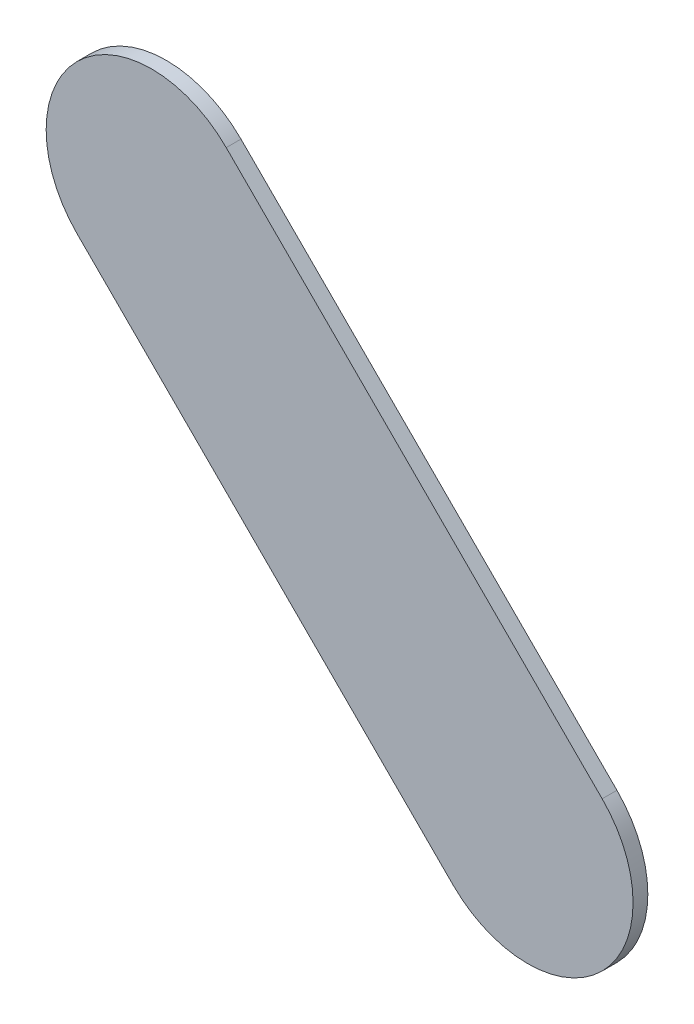
ISO-10303-21;
HEADER;
FILE_DESCRIPTION(('STEP AP214'),'2;1');
FILE_NAME('part.step','',(''),(''),'','','');
FILE_SCHEMA(('AUTOMOTIVE_DESIGN { 1 0 10303 214 1 1 1 1 }'));
ENDSEC;
DATA;
#1=APPLICATION_CONTEXT('core data for automotive mechanical design processes');
#2=APPLICATION_PROTOCOL_DEFINITION('international standard','automotive_design',2000,#1);
#3=PRODUCT_CONTEXT('',#1,'mechanical');
#4=PRODUCT('Part','Part','',(#3));
#5=PRODUCT_RELATED_PRODUCT_CATEGORY('part','',(#4));
#6=PRODUCT_DEFINITION_FORMATION('','',#4);
#7=PRODUCT_DEFINITION_CONTEXT('part definition',#1,'design');
#8=PRODUCT_DEFINITION('design','',#6,#7);
#9=PRODUCT_DEFINITION_SHAPE('','',#8);
#10=(LENGTH_UNIT() NAMED_UNIT(*) SI_UNIT(.MILLI.,.METRE.));
#11=(NAMED_UNIT(*) PLANE_ANGLE_UNIT() SI_UNIT($,.RADIAN.));
#12=(NAMED_UNIT(*) SI_UNIT($,.STERADIAN.) SOLID_ANGLE_UNIT());
#13=UNCERTAINTY_MEASURE_WITH_UNIT(LENGTH_MEASURE(1.E-05),#10,'distance_accuracy_value','');
#14=(GEOMETRIC_REPRESENTATION_CONTEXT(3) GLOBAL_UNCERTAINTY_ASSIGNED_CONTEXT((#13)) GLOBAL_UNIT_ASSIGNED_CONTEXT((#10,
#11,#12)) REPRESENTATION_CONTEXT('',''));
#15=CARTESIAN_POINT('',(0.,0.,0.));
#16=DIRECTION('',(0.,0.,1.));
#17=DIRECTION('',(1.,0.,0.));
#18=AXIS2_PLACEMENT_3D('',#15,#16,#17);
#19=CARTESIAN_POINT('',(131.687964,-72.214411,1.635));
#20=DIRECTION('',(0.,0.,1.));
#21=DIRECTION('',(1.,0.,0.));
#22=AXIS2_PLACEMENT_3D('',#19,#20,#21);
#23=PLANE('',#22);
#24=DIRECTION('',(-0.707106781186548,0.707106781186548,0.));
#25=VECTOR('',#24,1.);
#26=CARTESIAN_POINT('',(131.687964,-72.214411,1.635));
#27=LINE('',#26,#25);
#28=CARTESIAN_POINT('',(131.687964,-72.214411,1.635));
#29=VERTEX_POINT('',#28);
#30=CARTESIAN_POINT('',(130.796776,-71.323223,1.635));
#31=VERTEX_POINT('',#30);
#32=EDGE_CURVE('E96',#29,#31,#27,.T.);
#33=ORIENTED_EDGE('',*,*,#32,.T.);
#34=CARTESIAN_POINT('',(130.6199995,-71.4999995,1.635));
#35=DIRECTION('',(0.,0.,1.));
#36=DIRECTION('',(0.707106781186548,0.707106781186548,0.));
#37=AXIS2_PLACEMENT_3D('',#34,#35,#36);
#38=CIRCLE('',#37,0.249999723809);
#39=CARTESIAN_POINT('',(130.443223,-71.676776,1.635));
#40=VERTEX_POINT('',#39);
#41=EDGE_CURVE('E75',#31,#40,#38,.T.);
#42=ORIENTED_EDGE('',*,*,#41,.T.);
#43=DIRECTION('',(0.707106781186548,-0.707106781186548,0.));
#44=VECTOR('',#43,1.);
#45=CARTESIAN_POINT('',(130.443223,-71.676776,1.635));
#46=LINE('',#45,#44);
#47=CARTESIAN_POINT('',(131.334411,-72.567964,1.635));
#48=VERTEX_POINT('',#47);
#49=EDGE_CURVE('E80',#40,#48,#46,.T.);
#50=ORIENTED_EDGE('',*,*,#49,.T.);
#51=CARTESIAN_POINT('',(131.5111875,-72.3911875,1.635));
#52=DIRECTION('',(0.,0.,1.));
#53=DIRECTION('',(-0.707106781186548,-0.707106781186548,0.));
#54=AXIS2_PLACEMENT_3D('',#51,#52,#53);
#55=CIRCLE('',#54,0.249999723809);
#56=EDGE_CURVE('E11',#48,#29,#55,.T.);
#57=ORIENTED_EDGE('',*,*,#56,.T.);
#58=EDGE_LOOP('',(#33,#42,#50,#57));
#59=FACE_BOUND('',#58,.T.);
#60=ADVANCED_FACE('F17',(#59),#23,.T.);
#61=CARTESIAN_POINT('',(131.687964,-72.214411,1.6));
#62=DIRECTION('',(0.,0.,1.));
#63=DIRECTION('',(1.,0.,0.));
#64=AXIS2_PLACEMENT_3D('',#61,#62,#63);
#65=PLANE('',#64);
#66=CARTESIAN_POINT('',(131.5111875,-72.3911875,1.6));
#67=DIRECTION('',(0.,0.,1.));
#68=DIRECTION('',(-0.707106781186548,-0.707106781186548,0.));
#69=AXIS2_PLACEMENT_3D('',#66,#67,#68);
#70=CIRCLE('',#69,0.249999723809);
#71=CARTESIAN_POINT('',(131.334411,-72.567964,1.6));
#72=VERTEX_POINT('',#71);
#73=CARTESIAN_POINT('',(131.687964,-72.214411,1.6));
#74=VERTEX_POINT('',#73);
#75=EDGE_CURVE('E20',#72,#74,#70,.T.);
#76=ORIENTED_EDGE('',*,*,#75,.F.);
#77=DIRECTION('',(0.707106781186548,-0.707106781186548,0.));
#78=VECTOR('',#77,1.);
#79=CARTESIAN_POINT('',(130.443223,-71.676776,1.6));
#80=LINE('',#79,#78);
#81=CARTESIAN_POINT('',(130.443223,-71.676776,1.6));
#82=VERTEX_POINT('',#81);
#83=EDGE_CURVE('E65',#82,#72,#80,.T.);
#84=ORIENTED_EDGE('',*,*,#83,.F.);
#85=CARTESIAN_POINT('',(130.6199995,-71.4999995,1.6));
#86=DIRECTION('',(0.,0.,1.));
#87=DIRECTION('',(0.707106781186548,0.707106781186548,0.));
#88=AXIS2_PLACEMENT_3D('',#85,#86,#87);
#89=CIRCLE('',#88,0.249999723809);
#90=CARTESIAN_POINT('',(130.796776,-71.323223,1.6));
#91=VERTEX_POINT('',#90);
#92=EDGE_CURVE('E69',#91,#82,#89,.T.);
#93=ORIENTED_EDGE('',*,*,#92,.F.);
#94=DIRECTION('',(-0.707106781186548,0.707106781186548,0.));
#95=VECTOR('',#94,1.);
#96=CARTESIAN_POINT('',(131.687964,-72.214411,1.6));
#97=LINE('',#96,#95);
#98=EDGE_CURVE('E99',#74,#91,#97,.T.);
#99=ORIENTED_EDGE('',*,*,#98,.F.);
#100=EDGE_LOOP('',(#76,#84,#93,#99));
#101=FACE_BOUND('',#100,.T.);
#102=ADVANCED_FACE('F67',(#101),#65,.F.);
#103=CARTESIAN_POINT('',(131.5111875,-72.3911875,1.6));
#104=DIRECTION('',(0.,0.,-1.));
#105=DIRECTION('',(-0.707106781186548,-0.707106781186548,0.));
#106=AXIS2_PLACEMENT_3D('',#103,#104,#105);
#107=CYLINDRICAL_SURFACE('',#106,0.249999723809);
#108=ORIENTED_EDGE('',*,*,#75,.T.);
#109=DIRECTION('',(0.,0.,1.));
#110=VECTOR('',#109,1.);
#111=CARTESIAN_POINT('',(131.687964,-72.214411,1.6));
#112=LINE('',#111,#110);
#113=EDGE_CURVE('E90',#74,#29,#112,.T.);
#114=ORIENTED_EDGE('',*,*,#113,.T.);
#115=ORIENTED_EDGE('',*,*,#56,.F.);
#116=DIRECTION('',(0.,0.,1.));
#117=VECTOR('',#116,1.);
#118=CARTESIAN_POINT('',(131.334411,-72.567964,1.6));
#119=LINE('',#118,#117);
#120=EDGE_CURVE('E74',#72,#48,#119,.T.);
#121=ORIENTED_EDGE('',*,*,#120,.F.);
#122=EDGE_LOOP('',(#108,#114,#115,#121));
#123=FACE_BOUND('',#122,.T.);
#124=ADVANCED_FACE('F119',(#123),#107,.T.);
#125=CARTESIAN_POINT('',(130.443223,-71.676776,1.6));
#126=DIRECTION('',(0.707106781186548,0.707106781186548,0.));
#127=DIRECTION('',(0.,0.,-1.));
#128=AXIS2_PLACEMENT_3D('',#125,#126,#127);
#129=PLANE('',#128);
#130=ORIENTED_EDGE('',*,*,#83,.T.);
#131=ORIENTED_EDGE('',*,*,#120,.T.);
#132=ORIENTED_EDGE('',*,*,#49,.F.);
#133=DIRECTION('',(0.,0.,1.));
#134=VECTOR('',#133,1.);
#135=CARTESIAN_POINT('',(130.443223,-71.676776,1.6));
#136=LINE('',#135,#134);
#137=EDGE_CURVE('E78',#82,#40,#136,.T.);
#138=ORIENTED_EDGE('',*,*,#137,.F.);
#139=EDGE_LOOP('',(#130,#131,#132,#138));
#140=FACE_BOUND('',#139,.T.);
#141=ADVANCED_FACE('F79',(#140),#129,.F.);
#142=CARTESIAN_POINT('',(130.6199995,-71.4999995,1.6));
#143=DIRECTION('',(0.,0.,-1.));
#144=DIRECTION('',(0.707106781186548,0.707106781186548,0.));
#145=AXIS2_PLACEMENT_3D('',#142,#143,#144);
#146=CYLINDRICAL_SURFACE('',#145,0.249999723809);
#147=ORIENTED_EDGE('',*,*,#92,.T.);
#148=ORIENTED_EDGE('',*,*,#137,.T.);
#149=ORIENTED_EDGE('',*,*,#41,.F.);
#150=DIRECTION('',(0.,0.,1.));
#151=VECTOR('',#150,1.);
#152=CARTESIAN_POINT('',(130.796776,-71.323223,1.6));
#153=LINE('',#152,#151);
#154=EDGE_CURVE('E87',#91,#31,#153,.T.);
#155=ORIENTED_EDGE('',*,*,#154,.F.);
#156=EDGE_LOOP('',(#147,#148,#149,#155));
#157=FACE_BOUND('',#156,.T.);
#158=ADVANCED_FACE('F85',(#157),#146,.T.);
#159=CARTESIAN_POINT('',(131.687964,-72.214411,1.6));
#160=DIRECTION('',(-0.707106781186548,-0.707106781186548,0.));
#161=DIRECTION('',(-0.707106781186548,0.707106781186548,0.));
#162=AXIS2_PLACEMENT_3D('',#159,#160,#161);
#163=PLANE('',#162);
#164=ORIENTED_EDGE('',*,*,#98,.T.);
#165=ORIENTED_EDGE('',*,*,#154,.T.);
#166=ORIENTED_EDGE('',*,*,#32,.F.);
#167=ORIENTED_EDGE('',*,*,#113,.F.);
#168=EDGE_LOOP('',(#164,#165,#166,#167));
#169=FACE_BOUND('',#168,.T.);
#170=ADVANCED_FACE('F123',(#169),#163,.F.);
#171=CLOSED_SHELL('',(#60,#102,#124,#141,#158,#170));
#172=MANIFOLD_SOLID_BREP('B1',#171);
#173=ADVANCED_BREP_SHAPE_REPRESENTATION('',(#18,#172),#14);
#174=SHAPE_DEFINITION_REPRESENTATION(#9,#173);
ENDSEC;
END-ISO-10303-21;
